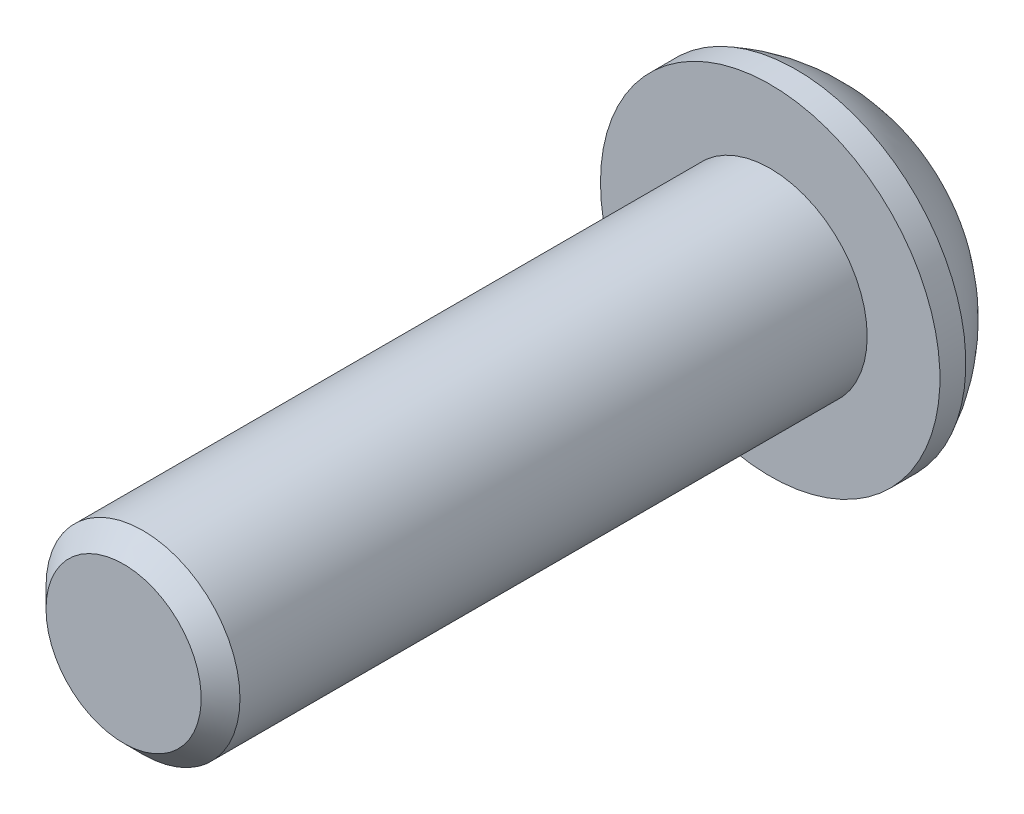
ISO-10303-21;
HEADER;
FILE_DESCRIPTION(('STEP AP214'),'2;1');
FILE_NAME('part.step','',(''),(''),'','','');
FILE_SCHEMA(('AUTOMOTIVE_DESIGN { 1 0 10303 214 1 1 1 1 }'));
ENDSEC;
DATA;
#1=APPLICATION_CONTEXT('core data for automotive mechanical design processes');
#2=APPLICATION_PROTOCOL_DEFINITION('international standard','automotive_design',2000,#1);
#3=PRODUCT_CONTEXT('',#1,'mechanical');
#4=PRODUCT('Part','Part','',(#3));
#5=PRODUCT_RELATED_PRODUCT_CATEGORY('part','',(#4));
#6=PRODUCT_DEFINITION_FORMATION('','',#4);
#7=PRODUCT_DEFINITION_CONTEXT('part definition',#1,'design');
#8=PRODUCT_DEFINITION('design','',#6,#7);
#9=PRODUCT_DEFINITION_SHAPE('','',#8);
#10=(LENGTH_UNIT() NAMED_UNIT(*) SI_UNIT(.MILLI.,.METRE.));
#11=(NAMED_UNIT(*) PLANE_ANGLE_UNIT() SI_UNIT($,.RADIAN.));
#12=(NAMED_UNIT(*) SI_UNIT($,.STERADIAN.) SOLID_ANGLE_UNIT());
#13=UNCERTAINTY_MEASURE_WITH_UNIT(LENGTH_MEASURE(1.E-05),#10,'distance_accuracy_value','');
#14=(GEOMETRIC_REPRESENTATION_CONTEXT(3) GLOBAL_UNCERTAINTY_ASSIGNED_CONTEXT((#13)) GLOBAL_UNIT_ASSIGNED_CONTEXT((#10,
#11,#12)) REPRESENTATION_CONTEXT('',''));
#15=CARTESIAN_POINT('',(0.,0.,0.));
#16=DIRECTION('',(0.,0.,1.));
#17=DIRECTION('',(1.,0.,0.));
#18=AXIS2_PLACEMENT_3D('',#15,#16,#17);
#19=CARTESIAN_POINT('',(0.,0.,-1.57));
#20=DIRECTION('',(0.,0.,1.));
#21=DIRECTION('',(1.,0.,0.));
#22=AXIS2_PLACEMENT_3D('',#19,#20,#21);
#23=PLANE('',#22);
#24=DIRECTION('',(-0.866025403784439,0.5,0.));
#25=VECTOR('',#24,1.);
#26=CARTESIAN_POINT('',(0.,2.3094010767585,-1.57));
#27=LINE('',#26,#25);
#28=CARTESIAN_POINT('',(0.,2.3094010767585,-1.57));
#29=VERTEX_POINT('',#28);
#30=CARTESIAN_POINT('',(2.,1.15470053837925,-1.57));
#31=VERTEX_POINT('',#30);
#32=EDGE_CURVE('E72',#29,#31,#27,.F.);
#33=ORIENTED_EDGE('',*,*,#32,.T.);
#34=DIRECTION('',(0.,1.,0.));
#35=VECTOR('',#34,1.);
#36=CARTESIAN_POINT('',(2.,1.15470053837925,-1.57));
#37=LINE('',#36,#35);
#38=CARTESIAN_POINT('',(2.,-1.15470053837925,-1.57));
#39=VERTEX_POINT('',#38);
#40=EDGE_CURVE('E125',#31,#39,#37,.F.);
#41=ORIENTED_EDGE('',*,*,#40,.T.);
#42=DIRECTION('',(0.866025403784439,0.499999999999999,0.));
#43=VECTOR('',#42,1.);
#44=CARTESIAN_POINT('',(2.,-1.15470053837925,-1.57));
#45=LINE('',#44,#43);
#46=CARTESIAN_POINT('',(0.,-2.3094010767585,-1.57));
#47=VERTEX_POINT('',#46);
#48=EDGE_CURVE('E130',#39,#47,#45,.F.);
#49=ORIENTED_EDGE('',*,*,#48,.T.);
#50=DIRECTION('',(0.866025403784438,-0.5,0.));
#51=VECTOR('',#50,1.);
#52=CARTESIAN_POINT('',(0.,-2.3094010767585,-1.57));
#53=LINE('',#52,#51);
#54=CARTESIAN_POINT('',(-2.,-1.15470053837925,-1.57));
#55=VERTEX_POINT('',#54);
#56=EDGE_CURVE('E134',#47,#55,#53,.F.);
#57=ORIENTED_EDGE('',*,*,#56,.T.);
#58=DIRECTION('',(0.,1.,0.));
#59=VECTOR('',#58,1.);
#60=CARTESIAN_POINT('',(-2.,-1.15470053837925,-1.57));
#61=LINE('',#60,#59);
#62=CARTESIAN_POINT('',(-2.,1.15470053837925,-1.57));
#63=VERTEX_POINT('',#62);
#64=EDGE_CURVE('E68',#55,#63,#61,.T.);
#65=ORIENTED_EDGE('',*,*,#64,.T.);
#66=DIRECTION('',(-0.866025403784439,-0.5,0.));
#67=VECTOR('',#66,1.);
#68=CARTESIAN_POINT('',(-2.,1.15470053837925,-1.57));
#69=LINE('',#68,#67);
#70=EDGE_CURVE('E70',#63,#29,#69,.F.);
#71=ORIENTED_EDGE('',*,*,#70,.T.);
#72=EDGE_LOOP('',(#33,#41,#49,#57,#65,#71));
#73=FACE_BOUND('',#72,.T.);
#74=ADVANCED_FACE('F17',(#73),#23,.F.);
#75=CARTESIAN_POINT('',(0.,2.3094010767585,-3.3));
#76=DIRECTION('',(0.5,0.866025403784439,0.));
#77=DIRECTION('',(-0.866025403784439,0.5,0.));
#78=AXIS2_PLACEMENT_3D('',#75,#76,#77);
#79=PLANE('',#78);
#80=ORIENTED_EDGE('',*,*,#32,.F.);
#81=DIRECTION('',(0.,0.,1.));
#82=VECTOR('',#81,1.);
#83=CARTESIAN_POINT('',(0.,2.3094010767585,-3.3));
#84=LINE('',#83,#82);
#85=CARTESIAN_POINT('',(0.,2.3094010767585,-3.3));
#86=VERTEX_POINT('',#85);
#87=EDGE_CURVE('E77',#29,#86,#84,.F.);
#88=ORIENTED_EDGE('',*,*,#87,.T.);
#89=DIRECTION('',(-0.866025403784439,0.5,0.));
#90=VECTOR('',#89,1.);
#91=CARTESIAN_POINT('',(2.,1.15470053837925,-3.3));
#92=LINE('',#91,#90);
#93=CARTESIAN_POINT('',(2.,1.15470053837925,-3.3));
#94=VERTEX_POINT('',#93);
#95=EDGE_CURVE('E122',#94,#86,#92,.T.);
#96=ORIENTED_EDGE('',*,*,#95,.F.);
#97=DIRECTION('',(0.,0.,-1.));
#98=VECTOR('',#97,1.);
#99=CARTESIAN_POINT('',(2.,1.15470053837925,-3.3));
#100=LINE('',#99,#98);
#101=EDGE_CURVE('E83',#94,#31,#100,.F.);
#102=ORIENTED_EDGE('',*,*,#101,.T.);
#103=EDGE_LOOP('',(#80,#88,#96,#102));
#104=FACE_BOUND('',#103,.T.);
#105=ADVANCED_FACE('F80',(#104),#79,.F.);
#106=CARTESIAN_POINT('',(-2.,1.15470053837925,-3.3));
#107=DIRECTION('',(-0.5,0.866025403784439,0.));
#108=DIRECTION('',(-0.866025403784439,-0.5,0.));
#109=AXIS2_PLACEMENT_3D('',#106,#107,#108);
#110=PLANE('',#109);
#111=ORIENTED_EDGE('',*,*,#70,.F.);
#112=DIRECTION('',(0.,0.,1.));
#113=VECTOR('',#112,1.);
#114=CARTESIAN_POINT('',(-2.,1.15470053837925,-3.3));
#115=LINE('',#114,#113);
#116=CARTESIAN_POINT('',(-2.,1.15470053837925,-3.3));
#117=VERTEX_POINT('',#116);
#118=EDGE_CURVE('E91',#63,#117,#115,.F.);
#119=ORIENTED_EDGE('',*,*,#118,.T.);
#120=DIRECTION('',(-0.866025403784439,-0.499999999999999,0.));
#121=VECTOR('',#120,1.);
#122=CARTESIAN_POINT('',(0.,2.3094010767585,-3.3));
#123=LINE('',#122,#121);
#124=EDGE_CURVE('E88',#86,#117,#123,.T.);
#125=ORIENTED_EDGE('',*,*,#124,.F.);
#126=ORIENTED_EDGE('',*,*,#87,.F.);
#127=EDGE_LOOP('',(#111,#119,#125,#126));
#128=FACE_BOUND('',#127,.T.);
#129=ADVANCED_FACE('F86',(#128),#110,.F.);
#130=CARTESIAN_POINT('',(-2.,-1.15470053837925,-3.3));
#131=DIRECTION('',(-1.,0.,0.));
#132=DIRECTION('',(0.,0.,1.));
#133=AXIS2_PLACEMENT_3D('',#130,#131,#132);
#134=PLANE('',#133);
#135=ORIENTED_EDGE('',*,*,#64,.F.);
#136=DIRECTION('',(0.,0.,1.));
#137=VECTOR('',#136,1.);
#138=CARTESIAN_POINT('',(-2.,-1.15470053837925,-3.3));
#139=LINE('',#138,#137);
#140=CARTESIAN_POINT('',(-2.,-1.15470053837925,-3.3));
#141=VERTEX_POINT('',#140);
#142=EDGE_CURVE('E132',#55,#141,#139,.F.);
#143=ORIENTED_EDGE('',*,*,#142,.T.);
#144=DIRECTION('',(0.,1.,0.));
#145=VECTOR('',#144,1.);
#146=CARTESIAN_POINT('',(-2.,-1.3125,-3.3));
#147=LINE('',#146,#145);
#148=EDGE_CURVE('E118',#117,#141,#147,.F.);
#149=ORIENTED_EDGE('',*,*,#148,.F.);
#150=ORIENTED_EDGE('',*,*,#118,.F.);
#151=EDGE_LOOP('',(#135,#143,#149,#150));
#152=FACE_BOUND('',#151,.T.);
#153=ADVANCED_FACE('F137',(#152),#134,.F.);
#154=CARTESIAN_POINT('',(0.,-2.3094010767585,-3.3));
#155=DIRECTION('',(-0.5,-0.866025403784438,0.));
#156=DIRECTION('',(0.866025403784438,-0.5,0.));
#157=AXIS2_PLACEMENT_3D('',#154,#155,#156);
#158=PLANE('',#157);
#159=ORIENTED_EDGE('',*,*,#56,.F.);
#160=DIRECTION('',(0.,0.,1.));
#161=VECTOR('',#160,1.);
#162=CARTESIAN_POINT('',(0.,-2.3094010767585,-3.3));
#163=LINE('',#162,#161);
#164=CARTESIAN_POINT('',(0.,-2.3094010767585,-3.3));
#165=VERTEX_POINT('',#164);
#166=EDGE_CURVE('E128',#47,#165,#163,.F.);
#167=ORIENTED_EDGE('',*,*,#166,.T.);
#168=DIRECTION('',(0.866025403784439,-0.5,0.));
#169=VECTOR('',#168,1.);
#170=CARTESIAN_POINT('',(-2.,-1.15470053837925,-3.3));
#171=LINE('',#170,#169);
#172=EDGE_CURVE('E115',#141,#165,#171,.T.);
#173=ORIENTED_EDGE('',*,*,#172,.F.);
#174=ORIENTED_EDGE('',*,*,#142,.F.);
#175=EDGE_LOOP('',(#159,#167,#173,#174));
#176=FACE_BOUND('',#175,.T.);
#177=ADVANCED_FACE('F149',(#176),#158,.F.);
#178=CARTESIAN_POINT('',(2.,-1.15470053837925,-3.3));
#179=DIRECTION('',(0.499999999999999,-0.866025403784439,0.));
#180=DIRECTION('',(0.866025403784439,0.499999999999999,0.));
#181=AXIS2_PLACEMENT_3D('',#178,#179,#180);
#182=PLANE('',#181);
#183=ORIENTED_EDGE('',*,*,#48,.F.);
#184=DIRECTION('',(0.,0.,-1.));
#185=VECTOR('',#184,1.);
#186=CARTESIAN_POINT('',(2.,-1.15470053837925,-3.3));
#187=LINE('',#186,#185);
#188=CARTESIAN_POINT('',(2.,-1.15470053837925,-3.3));
#189=VERTEX_POINT('',#188);
#190=EDGE_CURVE('E35',#39,#189,#187,.T.);
#191=ORIENTED_EDGE('',*,*,#190,.T.);
#192=DIRECTION('',(0.866025403784439,0.499999999999999,0.));
#193=VECTOR('',#192,1.);
#194=CARTESIAN_POINT('',(0.,-2.3094010767585,-3.3));
#195=LINE('',#194,#193);
#196=EDGE_CURVE('E112',#165,#189,#195,.T.);
#197=ORIENTED_EDGE('',*,*,#196,.F.);
#198=ORIENTED_EDGE('',*,*,#166,.F.);
#199=EDGE_LOOP('',(#183,#191,#197,#198));
#200=FACE_BOUND('',#199,.T.);
#201=ADVANCED_FACE('F147',(#200),#182,.F.);
#202=CARTESIAN_POINT('',(2.,1.15470053837925,-3.3));
#203=DIRECTION('',(1.,0.,0.));
#204=DIRECTION('',(0.,0.,-1.));
#205=AXIS2_PLACEMENT_3D('',#202,#203,#204);
#206=PLANE('',#205);
#207=ORIENTED_EDGE('',*,*,#40,.F.);
#208=ORIENTED_EDGE('',*,*,#101,.F.);
#209=DIRECTION('',(0.,1.,0.));
#210=VECTOR('',#209,1.);
#211=CARTESIAN_POINT('',(2.,-1.3125,-3.3));
#212=LINE('',#211,#210);
#213=EDGE_CURVE('E107',#189,#94,#212,.T.);
#214=ORIENTED_EDGE('',*,*,#213,.F.);
#215=ORIENTED_EDGE('',*,*,#190,.F.);
#216=EDGE_LOOP('',(#207,#208,#214,#215));
#217=FACE_BOUND('',#216,.T.);
#218=ADVANCED_FACE('F144',(#217),#206,.F.);
#219=CARTESIAN_POINT('',(0.,-1.3125,-3.3));
#220=DIRECTION('',(0.,0.,-1.));
#221=DIRECTION('',(-1.,0.,0.));
#222=AXIS2_PLACEMENT_3D('',#219,#220,#221);
#223=PLANE('',#222);
#224=ORIENTED_EDGE('',*,*,#196,.T.);
#225=ORIENTED_EDGE('',*,*,#213,.T.);
#226=ORIENTED_EDGE('',*,*,#95,.T.);
#227=ORIENTED_EDGE('',*,*,#124,.T.);
#228=ORIENTED_EDGE('',*,*,#148,.T.);
#229=ORIENTED_EDGE('',*,*,#172,.T.);
#230=EDGE_LOOP('',(#224,#225,#226,#227,#228,#229));
#231=FACE_BOUND('',#230,.T.);
#232=CARTESIAN_POINT('',(0.,0.,-3.3));
#233=DIRECTION('',(0.,0.,-1.));
#234=DIRECTION('',(-1.,0.,0.));
#235=AXIS2_PLACEMENT_3D('',#232,#233,#234);
#236=CIRCLE('',#235,2.625);
#237=CARTESIAN_POINT('',(-2.625,0.,-3.3));
#238=VERTEX_POINT('',#237);
#239=EDGE_CURVE('E20',#238,#238,#236,.F.);
#240=ORIENTED_EDGE('',*,*,#239,.F.);
#241=EDGE_LOOP('',(#240));
#242=FACE_BOUND('',#241,.T.);
#243=ADVANCED_FACE('F141',(#231,#242),#223,.T.);
#244=CARTESIAN_POINT('',(0.,0.,1.618125));
#245=DIRECTION('',(0.,0.,-1.));
#246=DIRECTION('',(0.,-1.,0.));
#247=AXIS2_PLACEMENT_3D('',#244,#245,#246);
#248=DEGENERATE_TOROIDAL_SURFACE('',#247,0.444047619047619,5.38000992597661,.T.);
#249=CARTESIAN_POINT('',(0.,0.,-0.800000000000002));
#250=DIRECTION('',(0.,0.,-1.));
#251=DIRECTION('',(-1.,0.,0.));
#252=AXIS2_PLACEMENT_3D('',#249,#250,#251);
#253=CIRCLE('',#252,5.25);
#254=CARTESIAN_POINT('',(-5.25,0.,-0.800000000000002));
#255=VERTEX_POINT('',#254);
#256=EDGE_CURVE('E99',#255,#255,#253,.F.);
#257=ORIENTED_EDGE('',*,*,#256,.F.);
#258=EDGE_LOOP('',(#257));
#259=FACE_BOUND('',#258,.T.);
#260=ORIENTED_EDGE('',*,*,#239,.T.);
#261=EDGE_LOOP('',(#260));
#262=FACE_BOUND('',#261,.T.);
#263=ADVANCED_FACE('F182',(#259,#262),#248,.T.);
#264=CARTESIAN_POINT('',(0.,0.,20.));
#265=DIRECTION('',(0.,0.,1.));
#266=DIRECTION('',(1.,0.,0.));
#267=AXIS2_PLACEMENT_3D('',#264,#265,#266);
#268=PLANE('',#267);
#269=CARTESIAN_POINT('',(0.,0.,19.999999999925));
#270=DIRECTION('',(0.,0.,-1.));
#271=DIRECTION('',(-1.,0.,0.));
#272=AXIS2_PLACEMENT_3D('',#269,#270,#271);
#273=CIRCLE('',#272,2.40000000002283);
#274=CARTESIAN_POINT('',(-2.40000000002283,0.,19.999999999925));
#275=VERTEX_POINT('',#274);
#276=EDGE_CURVE('E97',#275,#275,#273,.T.);
#277=ORIENTED_EDGE('',*,*,#276,.F.);
#278=EDGE_LOOP('',(#277));
#279=FACE_BOUND('',#278,.T.);
#280=ADVANCED_FACE('F178',(#279),#268,.T.);
#281=CARTESIAN_POINT('',(0.,0.,-0.4));
#282=DIRECTION('',(0.,0.,-1.));
#283=DIRECTION('',(-1.,0.,0.));
#284=AXIS2_PLACEMENT_3D('',#281,#282,#283);
#285=CYLINDRICAL_SURFACE('',#284,5.25);
#286=CARTESIAN_POINT('',(0.,0.,0.));
#287=DIRECTION('',(0.,0.,-1.));
#288=DIRECTION('',(-1.,0.,0.));
#289=AXIS2_PLACEMENT_3D('',#286,#287,#288);
#290=CIRCLE('',#289,5.25);
#291=CARTESIAN_POINT('',(-5.25,0.,0.));
#292=VERTEX_POINT('',#291);
#293=EDGE_CURVE('E95',#292,#292,#290,.T.);
#294=ORIENTED_EDGE('',*,*,#293,.T.);
#295=EDGE_LOOP('',(#294));
#296=FACE_BOUND('',#295,.T.);
#297=ORIENTED_EDGE('',*,*,#256,.T.);
#298=EDGE_LOOP('',(#297));
#299=FACE_BOUND('',#298,.T.);
#300=ADVANCED_FACE('F174',(#296,#299),#285,.T.);
#301=CARTESIAN_POINT('',(0.,0.,19.4000000000187));
#302=DIRECTION('',(0.,0.,-1.));
#303=DIRECTION('',(-1.,0.,0.));
#304=AXIS2_PLACEMENT_3D('',#301,#302,#303);
#305=CONICAL_SURFACE('',#304,2.9999999999859,0.785398163444818);
#306=CARTESIAN_POINT('',(0.,0.,19.4));
#307=DIRECTION('',(0.,0.,1.));
#308=DIRECTION('',(1.,0.,0.));
#309=AXIS2_PLACEMENT_3D('',#306,#307,#308);
#310=CIRCLE('',#309,3.);
#311=CARTESIAN_POINT('',(3.,0.,19.4));
#312=VERTEX_POINT('',#311);
#313=EDGE_CURVE('E26',#312,#312,#310,.F.);
#314=ORIENTED_EDGE('',*,*,#313,.F.);
#315=EDGE_LOOP('',(#314));
#316=FACE_BOUND('',#315,.T.);
#317=ORIENTED_EDGE('',*,*,#276,.T.);
#318=EDGE_LOOP('',(#317));
#319=FACE_BOUND('',#318,.T.);
#320=ADVANCED_FACE('F167',(#316,#319),#305,.T.);
#321=CARTESIAN_POINT('',(0.,-2.625,0.));
#322=DIRECTION('',(0.,0.,-1.));
#323=DIRECTION('',(-1.,0.,0.));
#324=AXIS2_PLACEMENT_3D('',#321,#322,#323);
#325=PLANE('',#324);
#326=CARTESIAN_POINT('',(0.,0.,0.));
#327=DIRECTION('',(0.,0.,1.));
#328=DIRECTION('',(1.,0.,0.));
#329=AXIS2_PLACEMENT_3D('',#326,#327,#328);
#330=CIRCLE('',#329,3.);
#331=CARTESIAN_POINT('',(3.,0.,0.));
#332=VERTEX_POINT('',#331);
#333=EDGE_CURVE('E11',#332,#332,#330,.T.);
#334=ORIENTED_EDGE('',*,*,#333,.F.);
#335=EDGE_LOOP('',(#334));
#336=FACE_BOUND('',#335,.T.);
#337=ORIENTED_EDGE('',*,*,#293,.F.);
#338=EDGE_LOOP('',(#337));
#339=FACE_BOUND('',#338,.T.);
#340=ADVANCED_FACE('F161',(#336,#339),#325,.F.);
#341=CARTESIAN_POINT('',(0.,0.,0.));
#342=DIRECTION('',(0.,0.,1.));
#343=DIRECTION('',(1.,0.,0.));
#344=AXIS2_PLACEMENT_3D('',#341,#342,#343);
#345=CYLINDRICAL_SURFACE('',#344,3.);
#346=ORIENTED_EDGE('',*,*,#333,.T.);
#347=EDGE_LOOP('',(#346));
#348=FACE_BOUND('',#347,.T.);
#349=ORIENTED_EDGE('',*,*,#313,.T.);
#350=EDGE_LOOP('',(#349));
#351=FACE_BOUND('',#350,.T.);
#352=ADVANCED_FACE('F159',(#348,#351),#345,.T.);
#353=CLOSED_SHELL('',(#74,#105,#129,#153,#177,#201,#218,#243,#263,#280,#300,#320,#340,#352));
#354=MANIFOLD_SOLID_BREP('B1',#353);
#355=ADVANCED_BREP_SHAPE_REPRESENTATION('',(#18,#354),#14);
#356=SHAPE_DEFINITION_REPRESENTATION(#9,#355);
ENDSEC;
END-ISO-10303-21;
